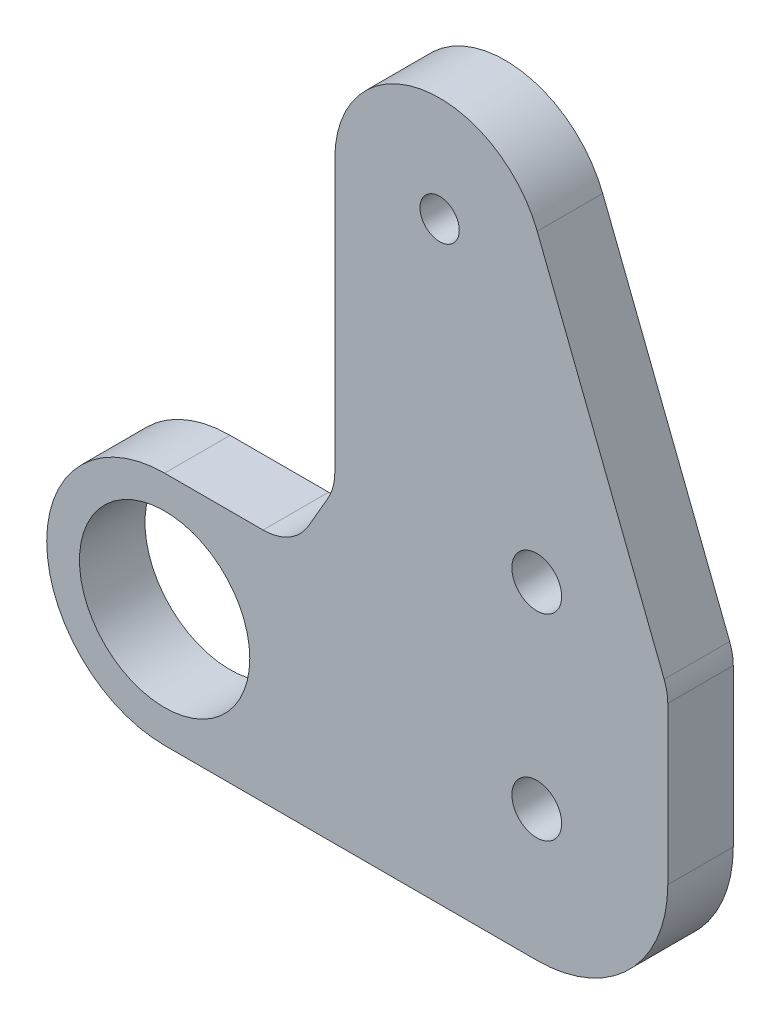
ISO-10303-21;
HEADER;
FILE_DESCRIPTION(('STEP AP214'),'2;1');
FILE_NAME('part.step','',(''),(''),'','','');
FILE_SCHEMA(('AUTOMOTIVE_DESIGN { 1 0 10303 214 1 1 1 1 }'));
ENDSEC;
DATA;
#1=APPLICATION_CONTEXT('core data for automotive mechanical design processes');
#2=APPLICATION_PROTOCOL_DEFINITION('international standard','automotive_design',2000,#1);
#3=PRODUCT_CONTEXT('',#1,'mechanical');
#4=PRODUCT('Part','Part','',(#3));
#5=PRODUCT_RELATED_PRODUCT_CATEGORY('part','',(#4));
#6=PRODUCT_DEFINITION_FORMATION('','',#4);
#7=PRODUCT_DEFINITION_CONTEXT('part definition',#1,'design');
#8=PRODUCT_DEFINITION('design','',#6,#7);
#9=PRODUCT_DEFINITION_SHAPE('','',#8);
#10=(LENGTH_UNIT() NAMED_UNIT(*) SI_UNIT(.MILLI.,.METRE.));
#11=(NAMED_UNIT(*) PLANE_ANGLE_UNIT() SI_UNIT($,.RADIAN.));
#12=(NAMED_UNIT(*) SI_UNIT($,.STERADIAN.) SOLID_ANGLE_UNIT());
#13=UNCERTAINTY_MEASURE_WITH_UNIT(LENGTH_MEASURE(1.E-05),#10,'distance_accuracy_value','');
#14=(GEOMETRIC_REPRESENTATION_CONTEXT(3) GLOBAL_UNCERTAINTY_ASSIGNED_CONTEXT((#13)) GLOBAL_UNIT_ASSIGNED_CONTEXT((#10,
#11,#12)) REPRESENTATION_CONTEXT('',''));
#15=CARTESIAN_POINT('',(0.,0.,0.));
#16=DIRECTION('',(0.,0.,1.));
#17=DIRECTION('',(1.,0.,0.));
#18=AXIS2_PLACEMENT_3D('',#15,#16,#17);
#19=CARTESIAN_POINT('',(0.,-8.99999961256903,5.));
#20=DIRECTION('',(0.,-1.,0.));
#21=DIRECTION('',(0.,0.,-1.));
#22=AXIS2_PLACEMENT_3D('',#19,#20,#21);
#23=PLANE('',#22);
#24=DIRECTION('',(-1.,0.,0.));
#25=VECTOR('',#24,1.);
#26=CARTESIAN_POINT('',(0.,-8.99999961256903,0.));
#27=LINE('',#26,#25);
#28=CARTESIAN_POINT('',(28.4053362998129,-8.99999961256903,0.));
#29=VERTEX_POINT('',#28);
#30=CARTESIAN_POINT('',(0.00264078697602074,-8.99999961256903,0.));
#31=VERTEX_POINT('',#30);
#32=EDGE_CURVE('E164',#29,#31,#27,.T.);
#33=ORIENTED_EDGE('',*,*,#32,.F.);
#34=DIRECTION('',(0.,0.,-1.));
#35=VECTOR('',#34,1.);
#36=CARTESIAN_POINT('',(28.4053362998129,-8.99999961256903,5.));
#37=LINE('',#36,#35);
#38=CARTESIAN_POINT('',(28.4053362998129,-8.99999961256903,5.));
#39=VERTEX_POINT('',#38);
#40=EDGE_CURVE('E11',#39,#29,#37,.T.);
#41=ORIENTED_EDGE('',*,*,#40,.F.);
#42=DIRECTION('',(-1.,0.,0.));
#43=VECTOR('',#42,1.);
#44=CARTESIAN_POINT('',(0.,-8.99999961256903,5.));
#45=LINE('',#44,#43);
#46=CARTESIAN_POINT('',(0.00264078697602074,-8.99999961256903,5.));
#47=VERTEX_POINT('',#46);
#48=EDGE_CURVE('E238',#39,#47,#45,.T.);
#49=ORIENTED_EDGE('',*,*,#48,.T.);
#50=DIRECTION('',(0.,0.,-1.));
#51=VECTOR('',#50,1.);
#52=CARTESIAN_POINT('',(0.00264078697602074,-8.99999961256903,5.));
#53=LINE('',#52,#51);
#54=EDGE_CURVE('E98',#47,#31,#53,.T.);
#55=ORIENTED_EDGE('',*,*,#54,.T.);
#56=EDGE_LOOP('',(#33,#41,#49,#55));
#57=FACE_BOUND('',#56,.T.);
#58=ADVANCED_FACE('F35',(#57),#23,.T.);
#59=CARTESIAN_POINT('',(28.4053362998125,1.00000038743086,5.));
#60=DIRECTION('',(0.,0.,-1.));
#61=DIRECTION('',(-1.,0.,0.));
#62=AXIS2_PLACEMENT_3D('',#59,#60,#61);
#63=CYLINDRICAL_SURFACE('',#62,9.9999999999999);
#64=CARTESIAN_POINT('',(28.4053362998125,1.00000038743086,0.));
#65=DIRECTION('',(0.,0.,1.));
#66=DIRECTION('',(1.,0.,0.));
#67=AXIS2_PLACEMENT_3D('',#64,#65,#66);
#68=CIRCLE('',#67,9.9999999999999);
#69=CARTESIAN_POINT('',(38.4053362767352,1.0006797569223,0.));
#70=VERTEX_POINT('',#69);
#71=EDGE_CURVE('E167',#29,#70,#68,.T.);
#72=ORIENTED_EDGE('',*,*,#71,.T.);
#73=DIRECTION('',(0.,0.,-1.));
#74=VECTOR('',#73,1.);
#75=CARTESIAN_POINT('',(38.4053362767352,1.0006797569223,5.));
#76=LINE('',#75,#74);
#77=CARTESIAN_POINT('',(38.4053362767352,1.0006797569223,5.));
#78=VERTEX_POINT('',#77);
#79=EDGE_CURVE('E44',#78,#70,#76,.T.);
#80=ORIENTED_EDGE('',*,*,#79,.F.);
#81=CARTESIAN_POINT('',(28.4053362998125,1.00000038743086,5.));
#82=DIRECTION('',(0.,0.,1.));
#83=DIRECTION('',(1.,0.,0.));
#84=AXIS2_PLACEMENT_3D('',#81,#82,#83);
#85=CIRCLE('',#84,9.9999999999999);
#86=EDGE_CURVE('E236',#39,#78,#85,.T.);
#87=ORIENTED_EDGE('',*,*,#86,.F.);
#88=ORIENTED_EDGE('',*,*,#40,.T.);
#89=EDGE_LOOP('',(#72,#80,#87,#88));
#90=FACE_BOUND('',#89,.T.);
#91=ADVANCED_FACE('F221',(#90),#63,.T.);
#92=CARTESIAN_POINT('',(38.4054040826077,0.00260914598796564,5.));
#93=DIRECTION('',(0.999999997692286,6.79369490900906E-05,0.));
#94=DIRECTION('',(-6.79369490900906E-05,0.999999997692286,0.));
#95=AXIS2_PLACEMENT_3D('',#92,#93,#94);
#96=PLANE('',#95);
#97=DIRECTION('',(6.79369490900906E-05,-0.999999997692286,0.));
#98=VECTOR('',#97,1.);
#99=CARTESIAN_POINT('',(38.4054040826077,0.00260914598796564,0.));
#100=LINE('',#99,#98);
#101=CARTESIAN_POINT('',(38.4045222720023,12.9824472924936,0.));
#102=VERTEX_POINT('',#101);
#103=EDGE_CURVE('E170',#102,#70,#100,.T.);
#104=ORIENTED_EDGE('',*,*,#103,.F.);
#105=DIRECTION('',(0.,0.,-1.));
#106=VECTOR('',#105,1.);
#107=CARTESIAN_POINT('',(38.4045222720023,12.9824472924936,5.));
#108=LINE('',#107,#106);
#109=CARTESIAN_POINT('',(38.4045222720023,12.9824472924936,5.));
#110=VERTEX_POINT('',#109);
#111=EDGE_CURVE('E211',#110,#102,#108,.T.);
#112=ORIENTED_EDGE('',*,*,#111,.F.);
#113=DIRECTION('',(6.79369490900906E-05,-0.999999997692286,0.));
#114=VECTOR('',#113,1.);
#115=CARTESIAN_POINT('',(38.4054040826077,0.00260914598796564,5.));
#116=LINE('',#115,#114);
#117=EDGE_CURVE('E218',#110,#78,#116,.T.);
#118=ORIENTED_EDGE('',*,*,#117,.T.);
#119=ORIENTED_EDGE('',*,*,#79,.T.);
#120=EDGE_LOOP('',(#104,#112,#118,#119));
#121=FACE_BOUND('',#120,.T.);
#122=ADVANCED_FACE('F216',(#121),#96,.T.);
#123=CARTESIAN_POINT('',(34.4045222812332,12.9821755446964,5.));
#124=DIRECTION('',(0.,0.,-1.));
#125=DIRECTION('',(-1.,0.,0.));
#126=AXIS2_PLACEMENT_3D('',#123,#124,#125);
#127=CYLINDRICAL_SURFACE('',#126,3.99999999999992);
#128=CARTESIAN_POINT('',(34.4045222812332,12.9821755446964,0.));
#129=DIRECTION('',(0.,0.,1.));
#130=DIRECTION('',(1.,0.,0.));
#131=AXIS2_PLACEMENT_3D('',#128,#129,#130);
#132=CIRCLE('',#131,3.99999999999992);
#133=CARTESIAN_POINT('',(38.1296924523658,14.4392641473914,0.));
#134=VERTEX_POINT('',#133);
#135=EDGE_CURVE('E173',#102,#134,#132,.T.);
#136=ORIENTED_EDGE('',*,*,#135,.T.);
#137=DIRECTION('',(0.,0.,-1.));
#138=VECTOR('',#137,1.);
#139=CARTESIAN_POINT('',(38.1296924523658,14.4392641473914,5.));
#140=LINE('',#139,#138);
#141=CARTESIAN_POINT('',(38.1296924523658,14.4392641473914,5.));
#142=VERTEX_POINT('',#141);
#143=EDGE_CURVE('E209',#142,#134,#140,.T.);
#144=ORIENTED_EDGE('',*,*,#143,.F.);
#145=CARTESIAN_POINT('',(34.4045222812332,12.9821755446964,5.));
#146=DIRECTION('',(0.,0.,1.));
#147=DIRECTION('',(1.,0.,0.));
#148=AXIS2_PLACEMENT_3D('',#145,#146,#147);
#149=CIRCLE('',#148,3.99999999999992);
#150=EDGE_CURVE('E232',#110,#142,#149,.T.);
#151=ORIENTED_EDGE('',*,*,#150,.F.);
#152=ORIENTED_EDGE('',*,*,#111,.T.);
#153=EDGE_LOOP('',(#136,#144,#151,#152));
#154=FACE_BOUND('',#153,.T.);
#155=ADVANCED_FACE('F229',(#154),#127,.T.);
#156=CARTESIAN_POINT('',(37.9685362489148,14.851273603013,5.));
#157=DIRECTION('',(0.93129254278323,0.364272150673567,0.));
#158=DIRECTION('',(-0.364272150673567,0.93129254278323,0.));
#159=AXIS2_PLACEMENT_3D('',#156,#157,#158);
#160=PLANE('',#159);
#161=DIRECTION('',(0.364272150673567,-0.93129254278323,0.));
#162=VECTOR('',#161,1.);
#163=CARTESIAN_POINT('',(37.9685362489148,14.851273603013,0.));
#164=LINE('',#163,#162);
#165=CARTESIAN_POINT('',(28.4403283170316,39.2109425391175,0.));
#166=VERTEX_POINT('',#165);
#167=EDGE_CURVE('E176',#166,#134,#164,.T.);
#168=ORIENTED_EDGE('',*,*,#167,.F.);
#169=DIRECTION('',(0.,0.,-1.));
#170=VECTOR('',#169,1.);
#171=CARTESIAN_POINT('',(28.4403283170316,39.2109425391175,5.));
#172=LINE('',#171,#170);
#173=CARTESIAN_POINT('',(28.4403283170316,39.2109425391175,5.));
#174=VERTEX_POINT('',#173);
#175=EDGE_CURVE('E207',#174,#166,#172,.T.);
#176=ORIENTED_EDGE('',*,*,#175,.F.);
#177=DIRECTION('',(0.364272150673567,-0.93129254278323,0.));
#178=VECTOR('',#177,1.);
#179=CARTESIAN_POINT('',(37.9685362489148,14.851273603013,5.));
#180=LINE('',#179,#178);
#181=EDGE_CURVE('E234',#174,#142,#180,.T.);
#182=ORIENTED_EDGE('',*,*,#181,.T.);
#183=ORIENTED_EDGE('',*,*,#143,.T.);
#184=EDGE_LOOP('',(#168,#176,#182,#183));
#185=FACE_BOUND('',#184,.T.);
#186=ADVANCED_FACE('F340',(#185),#160,.T.);
#187=CARTESIAN_POINT('',(20.9899879747661,36.2967653337283,5.));
#188=DIRECTION('',(0.,0.,-1.));
#189=DIRECTION('',(-1.,0.,0.));
#190=AXIS2_PLACEMENT_3D('',#187,#188,#189);
#191=CYLINDRICAL_SURFACE('',#190,7.99999999999993);
#192=CARTESIAN_POINT('',(20.9899879747661,36.2967653337283,0.));
#193=DIRECTION('',(0.,0.,1.));
#194=DIRECTION('',(1.,0.,0.));
#195=AXIS2_PLACEMENT_3D('',#192,#193,#194);
#196=CIRCLE('',#195,7.99999999999993);
#197=CARTESIAN_POINT('',(12.9899879747662,36.2967653337288,0.));
#198=VERTEX_POINT('',#197);
#199=EDGE_CURVE('E179',#166,#198,#196,.T.);
#200=ORIENTED_EDGE('',*,*,#199,.T.);
#201=DIRECTION('',(0.,0.,-1.));
#202=VECTOR('',#201,1.);
#203=CARTESIAN_POINT('',(12.9899879747662,36.2967653337288,5.));
#204=LINE('',#203,#202);
#205=CARTESIAN_POINT('',(12.9899879747662,36.2967653337288,5.));
#206=VERTEX_POINT('',#205);
#207=EDGE_CURVE('E204',#206,#198,#204,.T.);
#208=ORIENTED_EDGE('',*,*,#207,.F.);
#209=CARTESIAN_POINT('',(20.9899879747661,36.2967653337283,5.));
#210=DIRECTION('',(0.,0.,1.));
#211=DIRECTION('',(1.,0.,0.));
#212=AXIS2_PLACEMENT_3D('',#209,#210,#211);
#213=CIRCLE('',#212,7.99999999999993);
#214=EDGE_CURVE('E243',#174,#206,#213,.T.);
#215=ORIENTED_EDGE('',*,*,#214,.F.);
#216=ORIENTED_EDGE('',*,*,#175,.T.);
#217=EDGE_LOOP('',(#200,#208,#215,#216));
#218=FACE_BOUND('',#217,.T.);
#219=ADVANCED_FACE('F336',(#218),#191,.T.);
#220=CARTESIAN_POINT('',(12.9899879747669,2.36778967468692E-13,5.));
#221=DIRECTION('',(1.,0.,0.));
#222=DIRECTION('',(0.,1.,0.));
#223=AXIS2_PLACEMENT_3D('',#220,#221,#222);
#224=PLANE('',#223);
#225=DIRECTION('',(0.,-1.,0.));
#226=VECTOR('',#225,1.);
#227=CARTESIAN_POINT('',(12.9899879747669,2.36778967468692E-13,0.));
#228=LINE('',#227,#226);
#229=CARTESIAN_POINT('',(12.9899879747666,15.5499053457902,0.));
#230=VERTEX_POINT('',#229);
#231=EDGE_CURVE('E182',#198,#230,#228,.T.);
#232=ORIENTED_EDGE('',*,*,#231,.T.);
#233=DIRECTION('',(0.,0.,-1.));
#234=VECTOR('',#233,1.);
#235=CARTESIAN_POINT('',(12.9899879747666,15.5499053457902,5.));
#236=LINE('',#235,#234);
#237=CARTESIAN_POINT('',(12.9899879747666,15.5499053457902,5.));
#238=VERTEX_POINT('',#237);
#239=EDGE_CURVE('E202',#238,#230,#236,.T.);
#240=ORIENTED_EDGE('',*,*,#239,.F.);
#241=DIRECTION('',(0.,-1.,0.));
#242=VECTOR('',#241,1.);
#243=CARTESIAN_POINT('',(12.9899879747669,2.36778967468692E-13,5.));
#244=LINE('',#243,#242);
#245=EDGE_CURVE('E246',#206,#238,#244,.T.);
#246=ORIENTED_EDGE('',*,*,#245,.F.);
#247=ORIENTED_EDGE('',*,*,#207,.T.);
#248=EDGE_LOOP('',(#232,#240,#246,#247));
#249=FACE_BOUND('',#248,.T.);
#250=ADVANCED_FACE('F332',(#249),#224,.F.);
#251=CARTESIAN_POINT('',(8.98998797476658,15.5499053457894,5.));
#252=DIRECTION('',(0.,0.,-1.));
#253=DIRECTION('',(-1.,0.,0.));
#254=AXIS2_PLACEMENT_3D('',#251,#252,#253);
#255=CYLINDRICAL_SURFACE('',#254,3.99999999999991);
#256=CARTESIAN_POINT('',(8.98998797476658,15.5499053457894,0.));
#257=DIRECTION('',(0.,0.,1.));
#258=DIRECTION('',(1.,0.,0.));
#259=AXIS2_PLACEMENT_3D('',#256,#257,#258);
#260=CIRCLE('',#259,3.99999999999991);
#261=CARTESIAN_POINT('',(12.4529081016353,13.5478603425675,0.));
#262=VERTEX_POINT('',#261);
#263=EDGE_CURVE('E185',#262,#230,#260,.T.);
#264=ORIENTED_EDGE('',*,*,#263,.F.);
#265=DIRECTION('',(0.,0.,-1.));
#266=VECTOR('',#265,1.);
#267=CARTESIAN_POINT('',(12.4529081016353,13.5478603425675,5.));
#268=LINE('',#267,#266);
#269=CARTESIAN_POINT('',(12.4529081016353,13.5478603425675,5.));
#270=VERTEX_POINT('',#269);
#271=EDGE_CURVE('E200',#270,#262,#268,.T.);
#272=ORIENTED_EDGE('',*,*,#271,.F.);
#273=CARTESIAN_POINT('',(8.98998797476658,15.5499053457894,5.));
#274=DIRECTION('',(0.,0.,1.));
#275=DIRECTION('',(1.,0.,0.));
#276=AXIS2_PLACEMENT_3D('',#273,#274,#275);
#277=CIRCLE('',#276,3.99999999999991);
#278=EDGE_CURVE('E248',#270,#238,#277,.T.);
#279=ORIENTED_EDGE('',*,*,#278,.T.);
#280=ORIENTED_EDGE('',*,*,#239,.T.);
#281=EDGE_LOOP('',(#264,#272,#279,#280));
#282=FACE_BOUND('',#281,.T.);
#283=ADVANCED_FACE('F329',(#282),#255,.F.);
#284=CARTESIAN_POINT('',(3.46292012686918,-2.00204500322295,5.));
#285=DIRECTION('',(-0.865730031717142,0.50051125080565,0.));
#286=DIRECTION('',(-0.50051125080565,-0.865730031717142,0.));
#287=AXIS2_PLACEMENT_3D('',#284,#285,#286);
#288=PLANE('',#287);
#289=DIRECTION('',(0.50051125080565,0.865730031717142,0.));
#290=VECTOR('',#289,1.);
#291=CARTESIAN_POINT('',(3.46292012686918,-2.00204500322295,0.));
#292=LINE('',#291,#290);
#293=CARTESIAN_POINT('',(10.9787112259192,10.9979546093463,0.));
#294=VERTEX_POINT('',#293);
#295=EDGE_CURVE('E188',#294,#262,#292,.T.);
#296=ORIENTED_EDGE('',*,*,#295,.F.);
#297=DIRECTION('',(0.,0.,-1.));
#298=VECTOR('',#297,1.);
#299=CARTESIAN_POINT('',(10.9787112259192,10.9979546093463,5.));
#300=LINE('',#299,#298);
#301=CARTESIAN_POINT('',(10.9787112259192,10.9979546093463,5.));
#302=VERTEX_POINT('',#301);
#303=EDGE_CURVE('E140',#302,#294,#300,.T.);
#304=ORIENTED_EDGE('',*,*,#303,.F.);
#305=DIRECTION('',(0.50051125080565,0.865730031717142,0.));
#306=VECTOR('',#305,1.);
#307=CARTESIAN_POINT('',(3.46292012686918,-2.00204500322295,5.));
#308=LINE('',#307,#306);
#309=EDGE_CURVE('E147',#302,#270,#308,.T.);
#310=ORIENTED_EDGE('',*,*,#309,.T.);
#311=ORIENTED_EDGE('',*,*,#271,.T.);
#312=EDGE_LOOP('',(#296,#304,#310,#311));
#313=FACE_BOUND('',#312,.T.);
#314=ADVANCED_FACE('F252',(#313),#288,.T.);
#315=CARTESIAN_POINT('',(7.51579109905043,12.9999996125691,5.));
#316=DIRECTION('',(0.,0.,-1.));
#317=DIRECTION('',(-1.,0.,0.));
#318=AXIS2_PLACEMENT_3D('',#315,#316,#317);
#319=CYLINDRICAL_SURFACE('',#318,4.00000000000016);
#320=CARTESIAN_POINT('',(7.51579109905043,12.9999996125691,0.));
#321=DIRECTION('',(0.,0.,1.));
#322=DIRECTION('',(1.,0.,0.));
#323=AXIS2_PLACEMENT_3D('',#320,#321,#322);
#324=CIRCLE('',#323,4.00000000000016);
#325=CARTESIAN_POINT('',(7.51579109905043,8.99999961256914,0.));
#326=VERTEX_POINT('',#325);
#327=EDGE_CURVE('E135',#326,#294,#324,.T.);
#328=ORIENTED_EDGE('',*,*,#327,.F.);
#329=DIRECTION('',(0.,0.,-1.));
#330=VECTOR('',#329,1.);
#331=CARTESIAN_POINT('',(7.51579109905043,8.99999961256914,5.));
#332=LINE('',#331,#330);
#333=CARTESIAN_POINT('',(7.51579109905043,8.99999961256914,5.));
#334=VERTEX_POINT('',#333);
#335=EDGE_CURVE('E130',#334,#326,#332,.T.);
#336=ORIENTED_EDGE('',*,*,#335,.F.);
#337=CARTESIAN_POINT('',(7.51579109905043,12.9999996125691,5.));
#338=DIRECTION('',(0.,0.,1.));
#339=DIRECTION('',(1.,0.,0.));
#340=AXIS2_PLACEMENT_3D('',#337,#338,#339);
#341=CIRCLE('',#340,4.00000000000016);
#342=EDGE_CURVE('E133',#334,#302,#341,.T.);
#343=ORIENTED_EDGE('',*,*,#342,.T.);
#344=ORIENTED_EDGE('',*,*,#303,.T.);
#345=EDGE_LOOP('',(#328,#336,#343,#344));
#346=FACE_BOUND('',#345,.T.);
#347=ADVANCED_FACE('F132',(#346),#319,.F.);
#348=CARTESIAN_POINT('',(0.,8.99999961256914,5.));
#349=DIRECTION('',(0.,1.,0.));
#350=DIRECTION('',(0.,0.,1.));
#351=AXIS2_PLACEMENT_3D('',#348,#349,#350);
#352=PLANE('',#351);
#353=DIRECTION('',(1.,0.,0.));
#354=VECTOR('',#353,1.);
#355=CARTESIAN_POINT('',(0.,8.99999961256914,0.));
#356=LINE('',#355,#354);
#357=CARTESIAN_POINT('',(0.,8.99999961256914,0.));
#358=VERTEX_POINT('',#357);
#359=EDGE_CURVE('E192',#358,#326,#356,.T.);
#360=ORIENTED_EDGE('',*,*,#359,.F.);
#361=DIRECTION('',(0.,0.,-1.));
#362=VECTOR('',#361,1.);
#363=CARTESIAN_POINT('',(0.,8.99999961256914,5.));
#364=LINE('',#363,#362);
#365=CARTESIAN_POINT('',(0.,8.99999961256914,5.));
#366=VERTEX_POINT('',#365);
#367=EDGE_CURVE('E91',#366,#358,#364,.T.);
#368=ORIENTED_EDGE('',*,*,#367,.F.);
#369=DIRECTION('',(1.,0.,0.));
#370=VECTOR('',#369,1.);
#371=CARTESIAN_POINT('',(0.,8.99999961256914,5.));
#372=LINE('',#371,#370);
#373=EDGE_CURVE('E144',#366,#334,#372,.T.);
#374=ORIENTED_EDGE('',*,*,#373,.T.);
#375=ORIENTED_EDGE('',*,*,#335,.T.);
#376=EDGE_LOOP('',(#360,#368,#374,#375));
#377=FACE_BOUND('',#376,.T.);
#378=ADVANCED_FACE('F149',(#377),#352,.T.);
#379=CARTESIAN_POINT('',(28.4053363182726,15.9997286857888,5.));
#380=DIRECTION('',(0.,0.,-1.));
#381=DIRECTION('',(-1.,0.,0.));
#382=AXIS2_PLACEMENT_3D('',#379,#380,#381);
#383=CYLINDRICAL_SURFACE('',#382,1.90000000000001);
#384=CARTESIAN_POINT('',(28.4053363182726,15.9997286857888,5.));
#385=DIRECTION('',(0.,0.,1.));
#386=DIRECTION('',(1.,0.,0.));
#387=AXIS2_PLACEMENT_3D('',#384,#385,#386);
#388=CIRCLE('',#387,1.90000000000001);
#389=CARTESIAN_POINT('',(30.3053363182726,15.9997286857888,5.));
#390=VERTEX_POINT('',#389);
#391=EDGE_CURVE('E255',#390,#390,#388,.T.);
#392=ORIENTED_EDGE('',*,*,#391,.T.);
#393=EDGE_LOOP('',(#392));
#394=FACE_BOUND('',#393,.T.);
#395=CARTESIAN_POINT('',(28.4053363182726,15.9997286857888,0.));
#396=DIRECTION('',(0.,0.,1.));
#397=DIRECTION('',(1.,0.,0.));
#398=AXIS2_PLACEMENT_3D('',#395,#396,#397);
#399=CIRCLE('',#398,1.90000000000001);
#400=CARTESIAN_POINT('',(30.3053363182726,15.9997286857888,0.));
#401=VERTEX_POINT('',#400);
#402=EDGE_CURVE('E161',#401,#401,#399,.T.);
#403=ORIENTED_EDGE('',*,*,#402,.F.);
#404=EDGE_LOOP('',(#403));
#405=FACE_BOUND('',#404,.T.);
#406=ADVANCED_FACE('F287',(#394,#405),#383,.F.);
#407=CARTESIAN_POINT('',(20.9899879747661,36.2967653337283,5.));
#408=DIRECTION('',(0.,0.,-1.));
#409=DIRECTION('',(-1.,0.,0.));
#410=AXIS2_PLACEMENT_3D('',#407,#408,#409);
#411=CYLINDRICAL_SURFACE('',#410,1.50000000000096);
#412=CARTESIAN_POINT('',(20.9899879747661,36.2967653337283,5.));
#413=DIRECTION('',(0.,0.,1.));
#414=DIRECTION('',(1.,0.,0.));
#415=AXIS2_PLACEMENT_3D('',#412,#413,#414);
#416=CIRCLE('',#415,1.50000000000096);
#417=CARTESIAN_POINT('',(22.4899879747671,36.2967653337283,5.));
#418=VERTEX_POINT('',#417);
#419=EDGE_CURVE('E257',#418,#418,#416,.T.);
#420=ORIENTED_EDGE('',*,*,#419,.T.);
#421=EDGE_LOOP('',(#420));
#422=FACE_BOUND('',#421,.T.);
#423=CARTESIAN_POINT('',(20.9899879747661,36.2967653337283,0.));
#424=DIRECTION('',(0.,0.,1.));
#425=DIRECTION('',(1.,0.,0.));
#426=AXIS2_PLACEMENT_3D('',#423,#424,#425);
#427=CIRCLE('',#426,1.50000000000096);
#428=CARTESIAN_POINT('',(22.4899879747671,36.2967653337283,0.));
#429=VERTEX_POINT('',#428);
#430=EDGE_CURVE('E157',#429,#429,#427,.T.);
#431=ORIENTED_EDGE('',*,*,#430,.F.);
#432=EDGE_LOOP('',(#431));
#433=FACE_BOUND('',#432,.T.);
#434=ADVANCED_FACE('F290',(#422,#433),#411,.F.);
#435=CARTESIAN_POINT('',(28.4053363182726,0.999728685788737,5.));
#436=DIRECTION('',(0.,0.,-1.));
#437=DIRECTION('',(-1.,0.,0.));
#438=AXIS2_PLACEMENT_3D('',#435,#436,#437);
#439=CYLINDRICAL_SURFACE('',#438,1.90000000000001);
#440=CARTESIAN_POINT('',(28.4053363182726,0.999728685788737,5.));
#441=DIRECTION('',(0.,0.,1.));
#442=DIRECTION('',(1.,0.,0.));
#443=AXIS2_PLACEMENT_3D('',#440,#441,#442);
#444=CIRCLE('',#443,1.90000000000001);
#445=CARTESIAN_POINT('',(30.3053363182726,0.999728685788737,5.));
#446=VERTEX_POINT('',#445);
#447=EDGE_CURVE('E196',#446,#446,#444,.T.);
#448=ORIENTED_EDGE('',*,*,#447,.T.);
#449=EDGE_LOOP('',(#448));
#450=FACE_BOUND('',#449,.T.);
#451=CARTESIAN_POINT('',(28.4053363182726,0.999728685788737,0.));
#452=DIRECTION('',(0.,0.,1.));
#453=DIRECTION('',(1.,0.,0.));
#454=AXIS2_PLACEMENT_3D('',#451,#452,#453);
#455=CIRCLE('',#454,1.90000000000001);
#456=CARTESIAN_POINT('',(30.3053363182726,0.999728685788737,0.));
#457=VERTEX_POINT('',#456);
#458=EDGE_CURVE('E154',#457,#457,#455,.T.);
#459=ORIENTED_EDGE('',*,*,#458,.F.);
#460=EDGE_LOOP('',(#459));
#461=FACE_BOUND('',#460,.T.);
#462=ADVANCED_FACE('F37',(#450,#461),#439,.F.);
#463=CARTESIAN_POINT('',(-1.07205910815367E-12,0.,5.));
#464=DIRECTION('',(0.,0.,-1.));
#465=DIRECTION('',(-1.,0.,0.));
#466=AXIS2_PLACEMENT_3D('',#463,#464,#465);
#467=CYLINDRICAL_SURFACE('',#466,9.);
#468=CARTESIAN_POINT('',(-1.07205910815367E-12,0.,0.));
#469=DIRECTION('',(0.,0.,1.));
#470=DIRECTION('',(1.,0.,0.));
#471=AXIS2_PLACEMENT_3D('',#468,#469,#470);
#472=CIRCLE('',#471,9.);
#473=EDGE_CURVE('E194',#358,#31,#472,.T.);
#474=ORIENTED_EDGE('',*,*,#473,.T.);
#475=ORIENTED_EDGE('',*,*,#54,.F.);
#476=CARTESIAN_POINT('',(-1.07205910815367E-12,0.,5.));
#477=DIRECTION('',(0.,0.,1.));
#478=DIRECTION('',(1.,0.,0.));
#479=AXIS2_PLACEMENT_3D('',#476,#477,#478);
#480=CIRCLE('',#479,9.);
#481=EDGE_CURVE('E52',#366,#47,#480,.T.);
#482=ORIENTED_EDGE('',*,*,#481,.F.);
#483=ORIENTED_EDGE('',*,*,#367,.T.);
#484=EDGE_LOOP('',(#474,#475,#482,#483));
#485=FACE_BOUND('',#484,.T.);
#486=ADVANCED_FACE('F254',(#485),#467,.T.);
#487=CARTESIAN_POINT('',(0.,0.,5.));
#488=DIRECTION('',(0.,0.,1.));
#489=DIRECTION('',(1.,0.,0.));
#490=AXIS2_PLACEMENT_3D('',#487,#488,#489);
#491=PLANE('',#490);
#492=CARTESIAN_POINT('',(0.,0.,5.));
#493=DIRECTION('',(0.,0.,1.));
#494=DIRECTION('',(1.,0.,0.));
#495=AXIS2_PLACEMENT_3D('',#492,#493,#494);
#496=CIRCLE('',#495,6.5);
#497=CARTESIAN_POINT('',(6.5,0.,5.));
#498=VERTEX_POINT('',#497);
#499=EDGE_CURVE('E264',#498,#498,#496,.T.);
#500=ORIENTED_EDGE('',*,*,#499,.F.);
#501=EDGE_LOOP('',(#500));
#502=FACE_BOUND('',#501,.T.);
#503=ORIENTED_EDGE('',*,*,#447,.F.);
#504=EDGE_LOOP('',(#503));
#505=FACE_BOUND('',#504,.T.);
#506=ORIENTED_EDGE('',*,*,#419,.F.);
#507=EDGE_LOOP('',(#506));
#508=FACE_BOUND('',#507,.T.);
#509=ORIENTED_EDGE('',*,*,#391,.F.);
#510=EDGE_LOOP('',(#509));
#511=FACE_BOUND('',#510,.T.);
#512=ORIENTED_EDGE('',*,*,#48,.F.);
#513=ORIENTED_EDGE('',*,*,#86,.T.);
#514=ORIENTED_EDGE('',*,*,#117,.F.);
#515=ORIENTED_EDGE('',*,*,#150,.T.);
#516=ORIENTED_EDGE('',*,*,#181,.F.);
#517=ORIENTED_EDGE('',*,*,#214,.T.);
#518=ORIENTED_EDGE('',*,*,#245,.T.);
#519=ORIENTED_EDGE('',*,*,#278,.F.);
#520=ORIENTED_EDGE('',*,*,#309,.F.);
#521=ORIENTED_EDGE('',*,*,#342,.F.);
#522=ORIENTED_EDGE('',*,*,#373,.F.);
#523=ORIENTED_EDGE('',*,*,#481,.T.);
#524=EDGE_LOOP('',(#512,#513,#514,#515,#516,#517,#518,#519,#520,#521,#522,#523));
#525=FACE_BOUND('',#524,.T.);
#526=ADVANCED_FACE('F143',(#502,#505,#508,#511,#525),#491,.T.);
#527=CARTESIAN_POINT('',(0.,0.,0.));
#528=DIRECTION('',(0.,0.,1.));
#529=DIRECTION('',(1.,0.,0.));
#530=AXIS2_PLACEMENT_3D('',#527,#528,#529);
#531=PLANE('',#530);
#532=CARTESIAN_POINT('',(0.,0.,0.));
#533=DIRECTION('',(0.,0.,1.));
#534=DIRECTION('',(1.,0.,0.));
#535=AXIS2_PLACEMENT_3D('',#532,#533,#534);
#536=CIRCLE('',#535,6.5);
#537=CARTESIAN_POINT('',(6.5,0.,0.));
#538=VERTEX_POINT('',#537);
#539=EDGE_CURVE('E158',#538,#538,#536,.T.);
#540=ORIENTED_EDGE('',*,*,#539,.T.);
#541=EDGE_LOOP('',(#540));
#542=FACE_BOUND('',#541,.T.);
#543=ORIENTED_EDGE('',*,*,#458,.T.);
#544=EDGE_LOOP('',(#543));
#545=FACE_BOUND('',#544,.T.);
#546=ORIENTED_EDGE('',*,*,#430,.T.);
#547=EDGE_LOOP('',(#546));
#548=FACE_BOUND('',#547,.T.);
#549=ORIENTED_EDGE('',*,*,#402,.T.);
#550=EDGE_LOOP('',(#549));
#551=FACE_BOUND('',#550,.T.);
#552=ORIENTED_EDGE('',*,*,#32,.T.);
#553=ORIENTED_EDGE('',*,*,#473,.F.);
#554=ORIENTED_EDGE('',*,*,#359,.T.);
#555=ORIENTED_EDGE('',*,*,#327,.T.);
#556=ORIENTED_EDGE('',*,*,#295,.T.);
#557=ORIENTED_EDGE('',*,*,#263,.T.);
#558=ORIENTED_EDGE('',*,*,#231,.F.);
#559=ORIENTED_EDGE('',*,*,#199,.F.);
#560=ORIENTED_EDGE('',*,*,#167,.T.);
#561=ORIENTED_EDGE('',*,*,#135,.F.);
#562=ORIENTED_EDGE('',*,*,#103,.T.);
#563=ORIENTED_EDGE('',*,*,#71,.F.);
#564=EDGE_LOOP('',(#552,#553,#554,#555,#556,#557,#558,#559,#560,#561,#562,#563));
#565=FACE_BOUND('',#564,.T.);
#566=ADVANCED_FACE('F224',(#542,#545,#548,#551,#565),#531,.F.);
#567=CARTESIAN_POINT('',(0.,0.,0.));
#568=DIRECTION('',(0.,0.,1.));
#569=DIRECTION('',(1.,0.,0.));
#570=AXIS2_PLACEMENT_3D('',#567,#568,#569);
#571=CYLINDRICAL_SURFACE('',#570,6.5);
#572=ORIENTED_EDGE('',*,*,#539,.F.);
#573=EDGE_LOOP('',(#572));
#574=FACE_BOUND('',#573,.T.);
#575=ORIENTED_EDGE('',*,*,#499,.T.);
#576=EDGE_LOOP('',(#575));
#577=FACE_BOUND('',#576,.T.);
#578=ADVANCED_FACE('F272',(#574,#577),#571,.F.);
#579=CLOSED_SHELL('',(#58,#91,#122,#155,#186,#219,#250,#283,#314,#347,#378,#406,#434,#462,#486,
#526,#566,#578));
#580=MANIFOLD_SOLID_BREP('B2',#579);
#581=ADVANCED_BREP_SHAPE_REPRESENTATION('',(#18,#580),#14);
#582=SHAPE_DEFINITION_REPRESENTATION(#9,#581);
ENDSEC;
END-ISO-10303-21;
